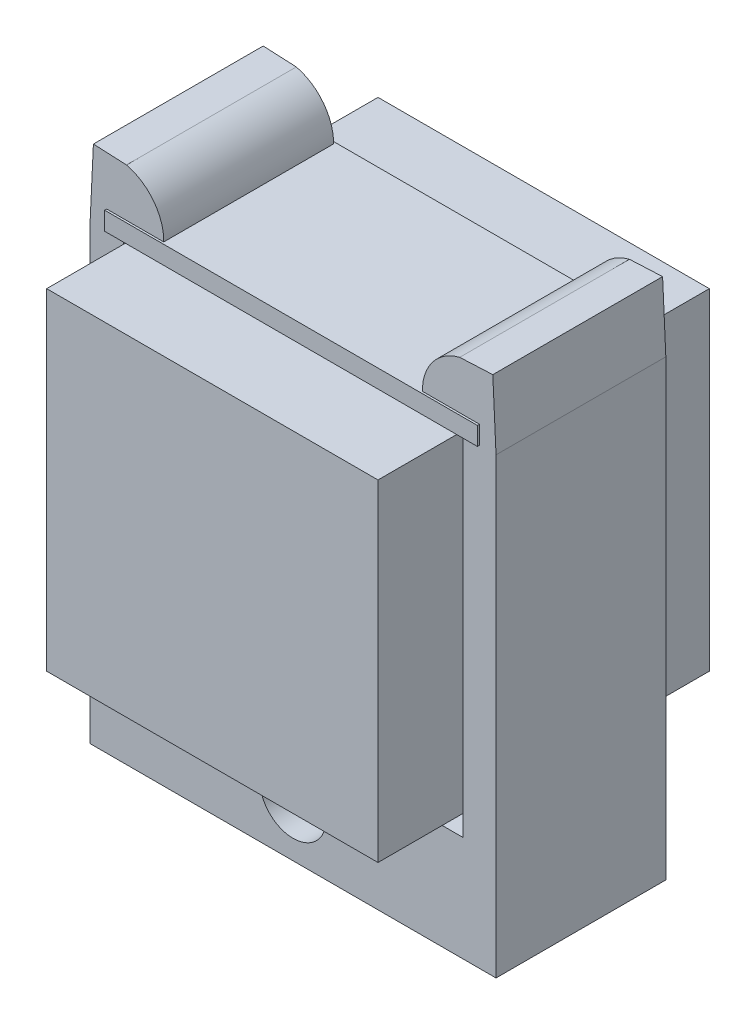
ISO-10303-21;
HEADER;
FILE_DESCRIPTION(('STEP AP214'),'2;1');
FILE_NAME('part.step','',(''),(''),'','','');
FILE_SCHEMA(('AUTOMOTIVE_DESIGN { 1 0 10303 214 1 1 1 1 }'));
ENDSEC;
DATA;
#1=APPLICATION_CONTEXT('core data for automotive mechanical design processes');
#2=APPLICATION_PROTOCOL_DEFINITION('international standard','automotive_design',2000,#1);
#3=PRODUCT_CONTEXT('',#1,'mechanical');
#4=PRODUCT('Part','Part','',(#3));
#5=PRODUCT_RELATED_PRODUCT_CATEGORY('part','',(#4));
#6=PRODUCT_DEFINITION_FORMATION('','',#4);
#7=PRODUCT_DEFINITION_CONTEXT('part definition',#1,'design');
#8=PRODUCT_DEFINITION('design','',#6,#7);
#9=PRODUCT_DEFINITION_SHAPE('','',#8);
#10=(LENGTH_UNIT() NAMED_UNIT(*) SI_UNIT(.MILLI.,.METRE.));
#11=(NAMED_UNIT(*) PLANE_ANGLE_UNIT() SI_UNIT($,.RADIAN.));
#12=(NAMED_UNIT(*) SI_UNIT($,.STERADIAN.) SOLID_ANGLE_UNIT());
#13=UNCERTAINTY_MEASURE_WITH_UNIT(LENGTH_MEASURE(1.E-05),#10,'distance_accuracy_value','');
#14=(GEOMETRIC_REPRESENTATION_CONTEXT(3) GLOBAL_UNCERTAINTY_ASSIGNED_CONTEXT((#13)) GLOBAL_UNIT_ASSIGNED_CONTEXT((#10,
#11,#12)) REPRESENTATION_CONTEXT('',''));
#15=CARTESIAN_POINT('',(0.,0.,0.));
#16=DIRECTION('',(0.,0.,1.));
#17=DIRECTION('',(1.,0.,0.));
#18=AXIS2_PLACEMENT_3D('',#15,#16,#17);
#19=CARTESIAN_POINT('',(-21.5280304458082,2.25144674939958,10.25));
#20=DIRECTION('',(0.,0.,-1.));
#21=DIRECTION('',(-1.,0.,0.));
#22=AXIS2_PLACEMENT_3D('',#19,#20,#21);
#23=CYLINDRICAL_SURFACE('',#22,5.92023811609857);
#24=CARTESIAN_POINT('',(-21.5280304458082,2.25144674939958,-10.25));
#25=DIRECTION('',(0.,0.,1.));
#26=DIRECTION('',(1.,0.,0.));
#27=AXIS2_PLACEMENT_3D('',#24,#25,#26);
#28=CIRCLE('',#27,5.92023811609857);
#29=CARTESIAN_POINT('',(-20.1144932238956,8.00045813167861,-10.25));
#30=VERTEX_POINT('',#29);
#31=CARTESIAN_POINT('',(-15.6144932238956,1.96984973883234,-10.25));
#32=VERTEX_POINT('',#31);
#33=EDGE_CURVE('E200',#30,#32,#28,.F.);
#34=ORIENTED_EDGE('',*,*,#33,.F.);
#35=DIRECTION('',(0.,0.,-1.));
#36=VECTOR('',#35,1.);
#37=CARTESIAN_POINT('',(-20.1144932238956,8.00045813167861,10.25));
#38=LINE('',#37,#36);
#39=CARTESIAN_POINT('',(-20.1144932238956,8.00045813167861,10.25));
#40=VERTEX_POINT('',#39);
#41=EDGE_CURVE('E12',#40,#30,#38,.T.);
#42=ORIENTED_EDGE('',*,*,#41,.F.);
#43=CARTESIAN_POINT('',(-21.5280304458082,2.25144674939958,10.25));
#44=DIRECTION('',(0.,0.,1.));
#45=DIRECTION('',(1.,0.,0.));
#46=AXIS2_PLACEMENT_3D('',#43,#44,#45);
#47=CIRCLE('',#46,5.92023811609857);
#48=CARTESIAN_POINT('',(-15.6144932238956,1.96984973883234,10.25));
#49=VERTEX_POINT('',#48);
#50=EDGE_CURVE('E243',#40,#49,#47,.F.);
#51=ORIENTED_EDGE('',*,*,#50,.T.);
#52=DIRECTION('',(0.,0.,-1.));
#53=VECTOR('',#52,1.);
#54=CARTESIAN_POINT('',(-15.6144932238956,1.96984973883234,10.25));
#55=LINE('',#54,#53);
#56=EDGE_CURVE('E71',#49,#32,#55,.T.);
#57=ORIENTED_EDGE('',*,*,#56,.T.);
#58=EDGE_LOOP('',(#34,#42,#51,#57));
#59=FACE_BOUND('',#58,.T.);
#60=ADVANCED_FACE('F55',(#59),#23,.T.);
#61=CARTESIAN_POINT('',(0.334604360953264,7.02669158001924,10.25));
#62=DIRECTION('',(0.0475651494154447,0.998868137724438,0.));
#63=DIRECTION('',(-0.998868137724438,0.0475651494154447,0.));
#64=AXIS2_PLACEMENT_3D('',#61,#62,#63);
#65=PLANE('',#64);
#66=DIRECTION('',(0.998868137724438,-0.0475651494154447,0.));
#67=VECTOR('',#66,1.);
#68=CARTESIAN_POINT('',(0.334604360953264,7.02669158001924,-10.25));
#69=LINE('',#68,#67);
#70=CARTESIAN_POINT('',(-24.1099657747934,8.19071872934039,-10.25));
#71=VERTEX_POINT('',#70);
#72=EDGE_CURVE('E202',#71,#30,#69,.T.);
#73=ORIENTED_EDGE('',*,*,#72,.F.);
#74=DIRECTION('',(0.,0.,-1.));
#75=VECTOR('',#74,1.);
#76=CARTESIAN_POINT('',(-24.1099657747934,8.19071872934039,10.25));
#77=LINE('',#76,#75);
#78=CARTESIAN_POINT('',(-24.1099657747934,8.19071872934039,10.25));
#79=VERTEX_POINT('',#78);
#80=EDGE_CURVE('E63',#79,#71,#77,.T.);
#81=ORIENTED_EDGE('',*,*,#80,.F.);
#82=DIRECTION('',(0.998868137724438,-0.0475651494154447,0.));
#83=VECTOR('',#82,1.);
#84=CARTESIAN_POINT('',(0.334604360953264,7.02669158001924,10.25));
#85=LINE('',#84,#83);
#86=EDGE_CURVE('E294',#79,#40,#85,.T.);
#87=ORIENTED_EDGE('',*,*,#86,.T.);
#88=ORIENTED_EDGE('',*,*,#41,.T.);
#89=EDGE_LOOP('',(#73,#81,#87,#88));
#90=FACE_BOUND('',#89,.T.);
#91=ADVANCED_FACE('F280',(#90),#65,.T.);
#92=CARTESIAN_POINT('',(-24.4445701357466,1.16402714932115,10.25));
#93=DIRECTION('',(-0.998868137724438,0.0475651494154446,0.));
#94=DIRECTION('',(-0.0475651494154446,-0.998868137724438,0.));
#95=AXIS2_PLACEMENT_3D('',#92,#93,#94);
#96=PLANE('',#95);
#97=DIRECTION('',(0.0475651494154446,0.998868137724438,0.));
#98=VECTOR('',#97,1.);
#99=CARTESIAN_POINT('',(-24.4445701357466,1.16402714932115,-10.25));
#100=LINE('',#99,#98);
#101=CARTESIAN_POINT('',(-24.5,0.,-10.25));
#102=VERTEX_POINT('',#101);
#103=EDGE_CURVE('E205',#102,#71,#100,.T.);
#104=ORIENTED_EDGE('',*,*,#103,.F.);
#105=DIRECTION('',(0.,0.,-1.));
#106=VECTOR('',#105,1.);
#107=CARTESIAN_POINT('',(-24.5,0.,10.25));
#108=LINE('',#107,#106);
#109=CARTESIAN_POINT('',(-24.5,0.,10.25));
#110=VERTEX_POINT('',#109);
#111=EDGE_CURVE('E269',#110,#102,#108,.T.);
#112=ORIENTED_EDGE('',*,*,#111,.F.);
#113=DIRECTION('',(0.0475651494154446,0.998868137724438,0.));
#114=VECTOR('',#113,1.);
#115=CARTESIAN_POINT('',(-24.4445701357466,1.16402714932115,10.25));
#116=LINE('',#115,#114);
#117=EDGE_CURVE('E276',#110,#79,#116,.T.);
#118=ORIENTED_EDGE('',*,*,#117,.T.);
#119=ORIENTED_EDGE('',*,*,#80,.T.);
#120=EDGE_LOOP('',(#104,#112,#118,#119));
#121=FACE_BOUND('',#120,.T.);
#122=ADVANCED_FACE('F274',(#121),#96,.T.);
#123=CARTESIAN_POINT('',(-24.5,0.,10.25));
#124=DIRECTION('',(-1.,0.,0.));
#125=DIRECTION('',(0.,0.,1.));
#126=AXIS2_PLACEMENT_3D('',#123,#124,#125);
#127=PLANE('',#126);
#128=DIRECTION('',(0.,1.,0.));
#129=VECTOR('',#128,1.);
#130=CARTESIAN_POINT('',(-24.5,0.,-10.25));
#131=LINE('',#130,#129);
#132=CARTESIAN_POINT('',(-24.5,-54.7,-10.25));
#133=VERTEX_POINT('',#132);
#134=EDGE_CURVE('E208',#133,#102,#131,.T.);
#135=ORIENTED_EDGE('',*,*,#134,.F.);
#136=DIRECTION('',(0.,0.,-1.));
#137=VECTOR('',#136,1.);
#138=CARTESIAN_POINT('',(-24.5,-54.7,10.25));
#139=LINE('',#138,#137);
#140=CARTESIAN_POINT('',(-24.5,-54.7,10.25));
#141=VERTEX_POINT('',#140);
#142=EDGE_CURVE('E267',#141,#133,#139,.T.);
#143=ORIENTED_EDGE('',*,*,#142,.F.);
#144=DIRECTION('',(0.,1.,0.));
#145=VECTOR('',#144,1.);
#146=CARTESIAN_POINT('',(-24.5,0.,10.25));
#147=LINE('',#146,#145);
#148=EDGE_CURVE('E291',#141,#110,#147,.T.);
#149=ORIENTED_EDGE('',*,*,#148,.T.);
#150=ORIENTED_EDGE('',*,*,#111,.T.);
#151=EDGE_LOOP('',(#135,#143,#149,#150));
#152=FACE_BOUND('',#151,.T.);
#153=ADVANCED_FACE('F288',(#152),#127,.T.);
#154=CARTESIAN_POINT('',(0.,-54.7,10.25));
#155=DIRECTION('',(0.,-1.,0.));
#156=DIRECTION('',(0.,0.,-1.));
#157=AXIS2_PLACEMENT_3D('',#154,#155,#156);
#158=PLANE('',#157);
#159=DIRECTION('',(-1.,0.,0.));
#160=VECTOR('',#159,1.);
#161=CARTESIAN_POINT('',(0.,-54.7,-10.25));
#162=LINE('',#161,#160);
#163=CARTESIAN_POINT('',(24.5,-54.7,-10.25));
#164=VERTEX_POINT('',#163);
#165=EDGE_CURVE('E211',#164,#133,#162,.T.);
#166=ORIENTED_EDGE('',*,*,#165,.F.);
#167=DIRECTION('',(0.,0.,-1.));
#168=VECTOR('',#167,1.);
#169=CARTESIAN_POINT('',(24.5,-54.7,10.25));
#170=LINE('',#169,#168);
#171=CARTESIAN_POINT('',(24.5,-54.7,10.25));
#172=VERTEX_POINT('',#171);
#173=EDGE_CURVE('E265',#172,#164,#170,.T.);
#174=ORIENTED_EDGE('',*,*,#173,.F.);
#175=DIRECTION('',(-1.,0.,0.));
#176=VECTOR('',#175,1.);
#177=CARTESIAN_POINT('',(0.,-54.7,10.25));
#178=LINE('',#177,#176);
#179=EDGE_CURVE('E296',#172,#141,#178,.T.);
#180=ORIENTED_EDGE('',*,*,#179,.T.);
#181=ORIENTED_EDGE('',*,*,#142,.T.);
#182=EDGE_LOOP('',(#166,#174,#180,#181));
#183=FACE_BOUND('',#182,.T.);
#184=ADVANCED_FACE('F343',(#183),#158,.T.);
#185=CARTESIAN_POINT('',(24.5,0.,10.25));
#186=DIRECTION('',(-1.,0.,0.));
#187=DIRECTION('',(0.,0.,1.));
#188=AXIS2_PLACEMENT_3D('',#185,#186,#187);
#189=PLANE('',#188);
#190=DIRECTION('',(0.,1.,0.));
#191=VECTOR('',#190,1.);
#192=CARTESIAN_POINT('',(24.5,0.,-10.25));
#193=LINE('',#192,#191);
#194=CARTESIAN_POINT('',(24.5,0.,-10.25));
#195=VERTEX_POINT('',#194);
#196=EDGE_CURVE('E214',#164,#195,#193,.T.);
#197=ORIENTED_EDGE('',*,*,#196,.T.);
#198=DIRECTION('',(0.,0.,-1.));
#199=VECTOR('',#198,1.);
#200=CARTESIAN_POINT('',(24.5,0.,10.25));
#201=LINE('',#200,#199);
#202=CARTESIAN_POINT('',(24.5,0.,10.25));
#203=VERTEX_POINT('',#202);
#204=EDGE_CURVE('E262',#203,#195,#201,.T.);
#205=ORIENTED_EDGE('',*,*,#204,.F.);
#206=DIRECTION('',(0.,1.,0.));
#207=VECTOR('',#206,1.);
#208=CARTESIAN_POINT('',(24.5,0.,10.25));
#209=LINE('',#208,#207);
#210=EDGE_CURVE('E302',#172,#203,#209,.T.);
#211=ORIENTED_EDGE('',*,*,#210,.F.);
#212=ORIENTED_EDGE('',*,*,#173,.T.);
#213=EDGE_LOOP('',(#197,#205,#211,#212));
#214=FACE_BOUND('',#213,.T.);
#215=ADVANCED_FACE('F346',(#214),#189,.F.);
#216=CARTESIAN_POINT('',(24.4445701357466,1.16402714932115,10.25));
#217=DIRECTION('',(-0.998868137724438,-0.0475651494154446,0.));
#218=DIRECTION('',(0.0475651494154446,-0.998868137724438,0.));
#219=AXIS2_PLACEMENT_3D('',#216,#217,#218);
#220=PLANE('',#219);
#221=DIRECTION('',(-0.0475651494154446,0.998868137724438,0.));
#222=VECTOR('',#221,1.);
#223=CARTESIAN_POINT('',(24.4445701357466,1.16402714932115,-10.25));
#224=LINE('',#223,#222);
#225=CARTESIAN_POINT('',(24.1099657747934,8.19071872934039,-10.25));
#226=VERTEX_POINT('',#225);
#227=EDGE_CURVE('E216',#195,#226,#224,.T.);
#228=ORIENTED_EDGE('',*,*,#227,.T.);
#229=DIRECTION('',(0.,0.,-1.));
#230=VECTOR('',#229,1.);
#231=CARTESIAN_POINT('',(24.1099657747934,8.19071872934039,10.25));
#232=LINE('',#231,#230);
#233=CARTESIAN_POINT('',(24.1099657747934,8.19071872934039,10.25));
#234=VERTEX_POINT('',#233);
#235=EDGE_CURVE('E259',#234,#226,#232,.T.);
#236=ORIENTED_EDGE('',*,*,#235,.F.);
#237=DIRECTION('',(-0.0475651494154446,0.998868137724438,0.));
#238=VECTOR('',#237,1.);
#239=CARTESIAN_POINT('',(24.4445701357466,1.16402714932115,10.25));
#240=LINE('',#239,#238);
#241=EDGE_CURVE('E304',#203,#234,#240,.T.);
#242=ORIENTED_EDGE('',*,*,#241,.F.);
#243=ORIENTED_EDGE('',*,*,#204,.T.);
#244=EDGE_LOOP('',(#228,#236,#242,#243));
#245=FACE_BOUND('',#244,.T.);
#246=ADVANCED_FACE('F350',(#245),#220,.F.);
#247=CARTESIAN_POINT('',(-0.334604360953264,7.02669158001924,10.25));
#248=DIRECTION('',(0.0475651494154447,-0.998868137724438,0.));
#249=DIRECTION('',(0.998868137724438,0.0475651494154447,0.));
#250=AXIS2_PLACEMENT_3D('',#247,#248,#249);
#251=PLANE('',#250);
#252=DIRECTION('',(-0.998868137724438,-0.0475651494154447,0.));
#253=VECTOR('',#252,1.);
#254=CARTESIAN_POINT('',(-0.334604360953264,7.02669158001924,-10.25));
#255=LINE('',#254,#253);
#256=CARTESIAN_POINT('',(20.1144932238956,8.00045813167861,-10.25));
#257=VERTEX_POINT('',#256);
#258=EDGE_CURVE('E218',#226,#257,#255,.T.);
#259=ORIENTED_EDGE('',*,*,#258,.T.);
#260=DIRECTION('',(0.,0.,-1.));
#261=VECTOR('',#260,1.);
#262=CARTESIAN_POINT('',(20.1144932238956,8.00045813167861,10.25));
#263=LINE('',#262,#261);
#264=CARTESIAN_POINT('',(20.1144932238956,8.00045813167861,10.25));
#265=VERTEX_POINT('',#264);
#266=EDGE_CURVE('E256',#265,#257,#263,.T.);
#267=ORIENTED_EDGE('',*,*,#266,.F.);
#268=DIRECTION('',(-0.998868137724438,-0.0475651494154447,0.));
#269=VECTOR('',#268,1.);
#270=CARTESIAN_POINT('',(-0.334604360953264,7.02669158001924,10.25));
#271=LINE('',#270,#269);
#272=EDGE_CURVE('E306',#234,#265,#271,.T.);
#273=ORIENTED_EDGE('',*,*,#272,.F.);
#274=ORIENTED_EDGE('',*,*,#235,.T.);
#275=EDGE_LOOP('',(#259,#267,#273,#274));
#276=FACE_BOUND('',#275,.T.);
#277=ADVANCED_FACE('F354',(#276),#251,.F.);
#278=CARTESIAN_POINT('',(21.5280304458082,2.25144674939958,10.25));
#279=DIRECTION('',(0.,0.,-1.));
#280=DIRECTION('',(-1.,0.,0.));
#281=AXIS2_PLACEMENT_3D('',#278,#279,#280);
#282=CYLINDRICAL_SURFACE('',#281,5.92023811609857);
#283=CARTESIAN_POINT('',(21.5280304458082,2.25144674939958,-10.25));
#284=DIRECTION('',(0.,0.,1.));
#285=DIRECTION('',(1.,0.,0.));
#286=AXIS2_PLACEMENT_3D('',#283,#284,#285);
#287=CIRCLE('',#286,5.92023811609857);
#288=CARTESIAN_POINT('',(15.6144932238956,1.96984973883234,-10.25));
#289=VERTEX_POINT('',#288);
#290=EDGE_CURVE('E220',#257,#289,#287,.T.);
#291=ORIENTED_EDGE('',*,*,#290,.T.);
#292=DIRECTION('',(0.,0.,-1.));
#293=VECTOR('',#292,1.);
#294=CARTESIAN_POINT('',(15.6144932238956,1.96984973883234,10.25));
#295=LINE('',#294,#293);
#296=CARTESIAN_POINT('',(15.6144932238956,1.96984973883234,10.25));
#297=VERTEX_POINT('',#296);
#298=EDGE_CURVE('E253',#297,#289,#295,.T.);
#299=ORIENTED_EDGE('',*,*,#298,.F.);
#300=CARTESIAN_POINT('',(21.5280304458082,2.25144674939958,10.25));
#301=DIRECTION('',(0.,0.,1.));
#302=DIRECTION('',(1.,0.,0.));
#303=AXIS2_PLACEMENT_3D('',#300,#301,#302);
#304=CIRCLE('',#303,5.92023811609857);
#305=EDGE_CURVE('E308',#265,#297,#304,.T.);
#306=ORIENTED_EDGE('',*,*,#305,.F.);
#307=ORIENTED_EDGE('',*,*,#266,.T.);
#308=EDGE_LOOP('',(#291,#299,#306,#307));
#309=FACE_BOUND('',#308,.T.);
#310=ADVANCED_FACE('F358',(#309),#282,.T.);
#311=CARTESIAN_POINT('',(-0.05826323821625,1.22352800254137,10.25));
#312=DIRECTION('',(-0.0475651494154449,0.998868137724438,0.));
#313=DIRECTION('',(-0.998868137724438,-0.0475651494154449,0.));
#314=AXIS2_PLACEMENT_3D('',#311,#312,#313);
#315=PLANE('',#314);
#316=DIRECTION('',(0.998868137724438,0.0475651494154449,0.));
#317=VECTOR('',#316,1.);
#318=CARTESIAN_POINT('',(-0.05826323821625,1.22352800254137,-10.25));
#319=LINE('',#318,#317);
#320=CARTESIAN_POINT('',(20.395356671286,2.19750990299376,-10.25));
#321=VERTEX_POINT('',#320);
#322=EDGE_CURVE('E222',#289,#321,#319,.T.);
#323=ORIENTED_EDGE('',*,*,#322,.T.);
#324=DIRECTION('',(0.,0.,-1.));
#325=VECTOR('',#324,1.);
#326=CARTESIAN_POINT('',(20.395356671286,2.19750990299376,10.25));
#327=LINE('',#326,#325);
#328=CARTESIAN_POINT('',(20.395356671286,2.19750990299376,10.25));
#329=VERTEX_POINT('',#328);
#330=EDGE_CURVE('E251',#329,#321,#327,.T.);
#331=ORIENTED_EDGE('',*,*,#330,.F.);
#332=DIRECTION('',(0.998868137724438,0.0475651494154449,0.));
#333=VECTOR('',#332,1.);
#334=CARTESIAN_POINT('',(-0.05826323821625,1.22352800254137,10.25));
#335=LINE('',#334,#333);
#336=EDGE_CURVE('E310',#297,#329,#335,.T.);
#337=ORIENTED_EDGE('',*,*,#336,.F.);
#338=ORIENTED_EDGE('',*,*,#298,.T.);
#339=EDGE_LOOP('',(#323,#331,#337,#338));
#340=FACE_BOUND('',#339,.T.);
#341=ADVANCED_FACE('F362',(#340),#315,.F.);
#342=CARTESIAN_POINT('',(20.4536199095023,0.973981900452354,10.25));
#343=DIRECTION('',(-0.998868137724438,-0.0475651494154428,0.));
#344=DIRECTION('',(0.0475651494154428,-0.998868137724438,0.));
#345=AXIS2_PLACEMENT_3D('',#342,#343,#344);
#346=PLANE('',#345);
#347=DIRECTION('',(-0.0475651494154428,0.998868137724438,0.));
#348=VECTOR('',#347,1.);
#349=CARTESIAN_POINT('',(20.4536199095023,0.973981900452354,-10.25));
#350=LINE('',#349,#348);
#351=CARTESIAN_POINT('',(20.5,0.,-10.25));
#352=VERTEX_POINT('',#351);
#353=EDGE_CURVE('E225',#352,#321,#350,.T.);
#354=ORIENTED_EDGE('',*,*,#353,.F.);
#355=DIRECTION('',(0.,0.,-1.));
#356=VECTOR('',#355,1.);
#357=CARTESIAN_POINT('',(20.5,0.,10.25));
#358=LINE('',#357,#356);
#359=CARTESIAN_POINT('',(20.5,0.,10.25));
#360=VERTEX_POINT('',#359);
#361=EDGE_CURVE('E249',#360,#352,#358,.T.);
#362=ORIENTED_EDGE('',*,*,#361,.F.);
#363=DIRECTION('',(-0.0475651494154428,0.998868137724438,0.));
#364=VECTOR('',#363,1.);
#365=CARTESIAN_POINT('',(20.4536199095023,0.973981900452354,10.25));
#366=LINE('',#365,#364);
#367=EDGE_CURVE('E312',#360,#329,#366,.T.);
#368=ORIENTED_EDGE('',*,*,#367,.T.);
#369=ORIENTED_EDGE('',*,*,#330,.T.);
#370=EDGE_LOOP('',(#354,#362,#368,#369));
#371=FACE_BOUND('',#370,.T.);
#372=ADVANCED_FACE('F366',(#371),#346,.T.);
#373=CARTESIAN_POINT('',(20.5,0.,10.25));
#374=DIRECTION('',(-1.,0.,0.));
#375=DIRECTION('',(0.,0.,1.));
#376=AXIS2_PLACEMENT_3D('',#373,#374,#375);
#377=PLANE('',#376);
#378=DIRECTION('',(0.,1.,0.));
#379=VECTOR('',#378,1.);
#380=CARTESIAN_POINT('',(20.5,0.,-10.25));
#381=LINE('',#380,#379);
#382=CARTESIAN_POINT('',(20.5,-42.,-10.25));
#383=VERTEX_POINT('',#382);
#384=EDGE_CURVE('E228',#383,#352,#381,.T.);
#385=ORIENTED_EDGE('',*,*,#384,.F.);
#386=DIRECTION('',(0.,0.,-1.));
#387=VECTOR('',#386,1.);
#388=CARTESIAN_POINT('',(20.5,-42.,10.25));
#389=LINE('',#388,#387);
#390=CARTESIAN_POINT('',(20.5,-42.,10.25));
#391=VERTEX_POINT('',#390);
#392=EDGE_CURVE('E247',#391,#383,#389,.T.);
#393=ORIENTED_EDGE('',*,*,#392,.F.);
#394=DIRECTION('',(0.,1.,0.));
#395=VECTOR('',#394,1.);
#396=CARTESIAN_POINT('',(20.5,0.,10.25));
#397=LINE('',#396,#395);
#398=EDGE_CURVE('E315',#391,#360,#397,.T.);
#399=ORIENTED_EDGE('',*,*,#398,.T.);
#400=ORIENTED_EDGE('',*,*,#361,.T.);
#401=EDGE_LOOP('',(#385,#393,#399,#400));
#402=FACE_BOUND('',#401,.T.);
#403=ADVANCED_FACE('F370',(#402),#377,.T.);
#404=CARTESIAN_POINT('',(0.,-42.,10.25));
#405=DIRECTION('',(0.,1.,0.));
#406=DIRECTION('',(0.,0.,1.));
#407=AXIS2_PLACEMENT_3D('',#404,#405,#406);
#408=PLANE('',#407);
#409=DIRECTION('',(1.,0.,0.));
#410=VECTOR('',#409,1.);
#411=CARTESIAN_POINT('',(0.,-42.,-10.25));
#412=LINE('',#411,#410);
#413=CARTESIAN_POINT('',(-20.5,-42.,-10.25));
#414=VERTEX_POINT('',#413);
#415=EDGE_CURVE('E231',#414,#383,#412,.T.);
#416=ORIENTED_EDGE('',*,*,#415,.F.);
#417=DIRECTION('',(0.,0.,-1.));
#418=VECTOR('',#417,1.);
#419=CARTESIAN_POINT('',(-20.5,-42.,10.25));
#420=LINE('',#419,#418);
#421=CARTESIAN_POINT('',(-20.5,-42.,10.25));
#422=VERTEX_POINT('',#421);
#423=EDGE_CURVE('E189',#422,#414,#420,.T.);
#424=ORIENTED_EDGE('',*,*,#423,.F.);
#425=DIRECTION('',(1.,0.,0.));
#426=VECTOR('',#425,1.);
#427=CARTESIAN_POINT('',(0.,-42.,10.25));
#428=LINE('',#427,#426);
#429=EDGE_CURVE('E179',#422,#391,#428,.T.);
#430=ORIENTED_EDGE('',*,*,#429,.T.);
#431=ORIENTED_EDGE('',*,*,#392,.T.);
#432=EDGE_LOOP('',(#416,#424,#430,#431));
#433=FACE_BOUND('',#432,.T.);
#434=ADVANCED_FACE('F319',(#433),#408,.T.);
#435=CARTESIAN_POINT('',(-20.5,0.,10.25));
#436=DIRECTION('',(-1.,0.,0.));
#437=DIRECTION('',(0.,0.,1.));
#438=AXIS2_PLACEMENT_3D('',#435,#436,#437);
#439=PLANE('',#438);
#440=DIRECTION('',(0.,1.,0.));
#441=VECTOR('',#440,1.);
#442=CARTESIAN_POINT('',(-20.5,0.,-10.25));
#443=LINE('',#442,#441);
#444=CARTESIAN_POINT('',(-20.5,0.,-10.25));
#445=VERTEX_POINT('',#444);
#446=EDGE_CURVE('E186',#414,#445,#443,.T.);
#447=ORIENTED_EDGE('',*,*,#446,.T.);
#448=DIRECTION('',(0.,0.,-1.));
#449=VECTOR('',#448,1.);
#450=CARTESIAN_POINT('',(-20.5,0.,10.25));
#451=LINE('',#450,#449);
#452=CARTESIAN_POINT('',(-20.5,0.,10.25));
#453=VERTEX_POINT('',#452);
#454=EDGE_CURVE('E183',#453,#445,#451,.T.);
#455=ORIENTED_EDGE('',*,*,#454,.F.);
#456=DIRECTION('',(0.,1.,0.));
#457=VECTOR('',#456,1.);
#458=CARTESIAN_POINT('',(-20.5,0.,10.25));
#459=LINE('',#458,#457);
#460=EDGE_CURVE('E170',#422,#453,#459,.T.);
#461=ORIENTED_EDGE('',*,*,#460,.F.);
#462=ORIENTED_EDGE('',*,*,#423,.T.);
#463=EDGE_LOOP('',(#447,#455,#461,#462));
#464=FACE_BOUND('',#463,.T.);
#465=ADVANCED_FACE('F184',(#464),#439,.F.);
#466=CARTESIAN_POINT('',(-20.4536199095023,0.973981900452354,10.25));
#467=DIRECTION('',(-0.998868137724438,0.0475651494154428,0.));
#468=DIRECTION('',(-0.0475651494154428,-0.998868137724438,0.));
#469=AXIS2_PLACEMENT_3D('',#466,#467,#468);
#470=PLANE('',#469);
#471=DIRECTION('',(0.0475651494154428,0.998868137724438,0.));
#472=VECTOR('',#471,1.);
#473=CARTESIAN_POINT('',(-20.4536199095023,0.973981900452354,-10.25));
#474=LINE('',#473,#472);
#475=CARTESIAN_POINT('',(-20.395356671286,2.19750990299376,-10.25));
#476=VERTEX_POINT('',#475);
#477=EDGE_CURVE('E235',#445,#476,#474,.T.);
#478=ORIENTED_EDGE('',*,*,#477,.T.);
#479=DIRECTION('',(0.,0.,-1.));
#480=VECTOR('',#479,1.);
#481=CARTESIAN_POINT('',(-20.395356671286,2.19750990299376,10.25));
#482=LINE('',#481,#480);
#483=CARTESIAN_POINT('',(-20.395356671286,2.19750990299376,10.25));
#484=VERTEX_POINT('',#483);
#485=EDGE_CURVE('E121',#484,#476,#482,.T.);
#486=ORIENTED_EDGE('',*,*,#485,.F.);
#487=DIRECTION('',(0.0475651494154428,0.998868137724438,0.));
#488=VECTOR('',#487,1.);
#489=CARTESIAN_POINT('',(-20.4536199095023,0.973981900452354,10.25));
#490=LINE('',#489,#488);
#491=EDGE_CURVE('E176',#453,#484,#490,.T.);
#492=ORIENTED_EDGE('',*,*,#491,.F.);
#493=ORIENTED_EDGE('',*,*,#454,.T.);
#494=EDGE_LOOP('',(#478,#486,#492,#493));
#495=FACE_BOUND('',#494,.T.);
#496=ADVANCED_FACE('F191',(#495),#470,.F.);
#497=CARTESIAN_POINT('',(0.05826323821625,1.22352800254137,10.25));
#498=DIRECTION('',(-0.0475651494154449,-0.998868137724438,0.));
#499=DIRECTION('',(0.998868137724438,-0.0475651494154449,0.));
#500=AXIS2_PLACEMENT_3D('',#497,#498,#499);
#501=PLANE('',#500);
#502=DIRECTION('',(-0.998868137724438,0.0475651494154449,0.));
#503=VECTOR('',#502,1.);
#504=CARTESIAN_POINT('',(0.05826323821625,1.22352800254137,-10.25));
#505=LINE('',#504,#503);
#506=EDGE_CURVE('E237',#32,#476,#505,.T.);
#507=ORIENTED_EDGE('',*,*,#506,.F.);
#508=ORIENTED_EDGE('',*,*,#56,.F.);
#509=DIRECTION('',(-0.998868137724438,0.0475651494154449,0.));
#510=VECTOR('',#509,1.);
#511=CARTESIAN_POINT('',(0.05826323821625,1.22352800254137,10.25));
#512=LINE('',#511,#510);
#513=EDGE_CURVE('E192',#49,#484,#512,.T.);
#514=ORIENTED_EDGE('',*,*,#513,.T.);
#515=ORIENTED_EDGE('',*,*,#485,.T.);
#516=EDGE_LOOP('',(#507,#508,#514,#515));
#517=FACE_BOUND('',#516,.T.);
#518=ADVANCED_FACE('F321',(#517),#501,.T.);
#519=CARTESIAN_POINT('',(0.,-48.35,10.25));
#520=DIRECTION('',(0.,0.,-1.));
#521=DIRECTION('',(-1.,0.,0.));
#522=AXIS2_PLACEMENT_3D('',#519,#520,#521);
#523=CYLINDRICAL_SURFACE('',#522,4.);
#524=CARTESIAN_POINT('',(0.,-48.35,10.25));
#525=DIRECTION('',(0.,0.,1.));
#526=DIRECTION('',(1.,0.,0.));
#527=AXIS2_PLACEMENT_3D('',#524,#525,#526);
#528=CIRCLE('',#527,4.);
#529=CARTESIAN_POINT('',(4.,-48.35,10.25));
#530=VERTEX_POINT('',#529);
#531=EDGE_CURVE('E194',#530,#530,#528,.T.);
#532=ORIENTED_EDGE('',*,*,#531,.T.);
#533=EDGE_LOOP('',(#532));
#534=FACE_BOUND('',#533,.T.);
#535=CARTESIAN_POINT('',(0.,-48.35,-10.25));
#536=DIRECTION('',(0.,0.,1.));
#537=DIRECTION('',(1.,0.,0.));
#538=AXIS2_PLACEMENT_3D('',#535,#536,#537);
#539=CIRCLE('',#538,4.);
#540=CARTESIAN_POINT('',(4.,-48.35,-10.25));
#541=VERTEX_POINT('',#540);
#542=EDGE_CURVE('E240',#541,#541,#539,.T.);
#543=ORIENTED_EDGE('',*,*,#542,.F.);
#544=EDGE_LOOP('',(#543));
#545=FACE_BOUND('',#544,.T.);
#546=ADVANCED_FACE('F323',(#534,#545),#523,.F.);
#547=CARTESIAN_POINT('',(0.,0.,10.25));
#548=DIRECTION('',(0.,0.,1.));
#549=DIRECTION('',(1.,0.,0.));
#550=AXIS2_PLACEMENT_3D('',#547,#548,#549);
#551=PLANE('',#550);
#552=ORIENTED_EDGE('',*,*,#50,.F.);
#553=ORIENTED_EDGE('',*,*,#86,.F.);
#554=ORIENTED_EDGE('',*,*,#117,.F.);
#555=ORIENTED_EDGE('',*,*,#148,.F.);
#556=ORIENTED_EDGE('',*,*,#179,.F.);
#557=ORIENTED_EDGE('',*,*,#210,.T.);
#558=ORIENTED_EDGE('',*,*,#241,.T.);
#559=ORIENTED_EDGE('',*,*,#272,.T.);
#560=ORIENTED_EDGE('',*,*,#305,.T.);
#561=ORIENTED_EDGE('',*,*,#336,.T.);
#562=ORIENTED_EDGE('',*,*,#367,.F.);
#563=ORIENTED_EDGE('',*,*,#398,.F.);
#564=ORIENTED_EDGE('',*,*,#429,.F.);
#565=ORIENTED_EDGE('',*,*,#460,.T.);
#566=ORIENTED_EDGE('',*,*,#491,.T.);
#567=ORIENTED_EDGE('',*,*,#513,.F.);
#568=EDGE_LOOP('',(#552,#553,#554,#555,#556,#557,#558,#559,#560,#561,#562,#563,#564,#565,#566,#567));
#569=FACE_BOUND('',#568,.T.);
#570=ORIENTED_EDGE('',*,*,#531,.F.);
#571=EDGE_LOOP('',(#570));
#572=FACE_BOUND('',#571,.T.);
#573=ADVANCED_FACE('F172',(#569,#572),#551,.T.);
#574=CARTESIAN_POINT('',(0.,0.,-10.25));
#575=DIRECTION('',(0.,0.,1.));
#576=DIRECTION('',(1.,0.,0.));
#577=AXIS2_PLACEMENT_3D('',#574,#575,#576);
#578=PLANE('',#577);
#579=ORIENTED_EDGE('',*,*,#33,.T.);
#580=ORIENTED_EDGE('',*,*,#506,.T.);
#581=ORIENTED_EDGE('',*,*,#477,.F.);
#582=ORIENTED_EDGE('',*,*,#446,.F.);
#583=ORIENTED_EDGE('',*,*,#415,.T.);
#584=ORIENTED_EDGE('',*,*,#384,.T.);
#585=ORIENTED_EDGE('',*,*,#353,.T.);
#586=ORIENTED_EDGE('',*,*,#322,.F.);
#587=ORIENTED_EDGE('',*,*,#290,.F.);
#588=ORIENTED_EDGE('',*,*,#258,.F.);
#589=ORIENTED_EDGE('',*,*,#227,.F.);
#590=ORIENTED_EDGE('',*,*,#196,.F.);
#591=ORIENTED_EDGE('',*,*,#165,.T.);
#592=ORIENTED_EDGE('',*,*,#134,.T.);
#593=ORIENTED_EDGE('',*,*,#103,.T.);
#594=ORIENTED_EDGE('',*,*,#72,.T.);
#595=EDGE_LOOP('',(#579,#580,#581,#582,#583,#584,#585,#586,#587,#588,#589,#590,#591,#592,#593,#594));
#596=FACE_BOUND('',#595,.T.);
#597=ORIENTED_EDGE('',*,*,#542,.T.);
#598=EDGE_LOOP('',(#597));
#599=FACE_BOUND('',#598,.T.);
#600=ADVANCED_FACE('F282',(#596,#599),#578,.F.);
#601=CLOSED_SHELL('',(#60,#91,#122,#153,#184,#215,#246,#277,#310,#341,#372,#403,#434,#465,#496,
#518,#546,#573,#600));
#602=MANIFOLD_SOLID_BREP('B2',#601);
#603=CARTESIAN_POINT('',(20.,-40.,20.));
#604=DIRECTION('',(1.,0.,0.));
#605=DIRECTION('',(0.,0.,-1.));
#606=AXIS2_PLACEMENT_3D('',#603,#604,#605);
#607=PLANE('',#606);
#608=DIRECTION('',(0.,0.,-1.));
#609=VECTOR('',#608,1.);
#610=CARTESIAN_POINT('',(20.,0.,20.));
#611=LINE('',#610,#609);
#612=CARTESIAN_POINT('',(20.,0.,20.));
#613=VERTEX_POINT('',#612);
#614=CARTESIAN_POINT('',(20.,0.,-20.));
#615=VERTEX_POINT('',#614);
#616=EDGE_CURVE('E653',#613,#615,#611,.T.);
#617=ORIENTED_EDGE('',*,*,#616,.F.);
#618=DIRECTION('',(0.,1.,0.));
#619=VECTOR('',#618,1.);
#620=CARTESIAN_POINT('',(20.,-40.,20.));
#621=LINE('',#620,#619);
#622=CARTESIAN_POINT('',(20.,-40.,20.));
#623=VERTEX_POINT('',#622);
#624=EDGE_CURVE('E53',#623,#613,#621,.T.);
#625=ORIENTED_EDGE('',*,*,#624,.F.);
#626=DIRECTION('',(0.,0.,-1.));
#627=VECTOR('',#626,1.);
#628=CARTESIAN_POINT('',(20.,-40.,20.));
#629=LINE('',#628,#627);
#630=CARTESIAN_POINT('',(20.,-40.,-20.));
#631=VERTEX_POINT('',#630);
#632=EDGE_CURVE('E645',#623,#631,#629,.T.);
#633=ORIENTED_EDGE('',*,*,#632,.T.);
#634=DIRECTION('',(0.,1.,0.));
#635=VECTOR('',#634,1.);
#636=CARTESIAN_POINT('',(20.,-40.,-20.));
#637=LINE('',#636,#635);
#638=EDGE_CURVE('E586',#631,#615,#637,.T.);
#639=ORIENTED_EDGE('',*,*,#638,.T.);
#640=EDGE_LOOP('',(#617,#625,#633,#639));
#641=FACE_BOUND('',#640,.T.);
#642=ADVANCED_FACE('F583',(#641),#607,.T.);
#643=CARTESIAN_POINT('',(-20.,-40.,20.));
#644=DIRECTION('',(0.,0.,1.));
#645=DIRECTION('',(1.,0.,0.));
#646=AXIS2_PLACEMENT_3D('',#643,#644,#645);
#647=PLANE('',#646);
#648=DIRECTION('',(1.,0.,0.));
#649=VECTOR('',#648,1.);
#650=CARTESIAN_POINT('',(-20.,0.,20.));
#651=LINE('',#650,#649);
#652=CARTESIAN_POINT('',(-20.,0.,20.));
#653=VERTEX_POINT('',#652);
#654=EDGE_CURVE('E648',#653,#613,#651,.T.);
#655=ORIENTED_EDGE('',*,*,#654,.F.);
#656=DIRECTION('',(0.,1.,0.));
#657=VECTOR('',#656,1.);
#658=CARTESIAN_POINT('',(-20.,-40.,20.));
#659=LINE('',#658,#657);
#660=CARTESIAN_POINT('',(-20.,-40.,20.));
#661=VERTEX_POINT('',#660);
#662=EDGE_CURVE('E593',#661,#653,#659,.T.);
#663=ORIENTED_EDGE('',*,*,#662,.F.);
#664=DIRECTION('',(1.,0.,0.));
#665=VECTOR('',#664,1.);
#666=CARTESIAN_POINT('',(-20.,-40.,20.));
#667=LINE('',#666,#665);
#668=EDGE_CURVE('E640',#661,#623,#667,.T.);
#669=ORIENTED_EDGE('',*,*,#668,.T.);
#670=ORIENTED_EDGE('',*,*,#624,.T.);
#671=EDGE_LOOP('',(#655,#663,#669,#670));
#672=FACE_BOUND('',#671,.T.);
#673=ADVANCED_FACE('F669',(#672),#647,.T.);
#674=CARTESIAN_POINT('',(-20.,-40.,20.));
#675=DIRECTION('',(-1.,0.,0.));
#676=DIRECTION('',(0.,0.,1.));
#677=AXIS2_PLACEMENT_3D('',#674,#675,#676);
#678=PLANE('',#677);
#679=DIRECTION('',(0.,0.,1.));
#680=VECTOR('',#679,1.);
#681=CARTESIAN_POINT('',(-20.,0.,20.));
#682=LINE('',#681,#680);
#683=CARTESIAN_POINT('',(-20.,0.,-20.));
#684=VERTEX_POINT('',#683);
#685=EDGE_CURVE('E634',#684,#653,#682,.T.);
#686=ORIENTED_EDGE('',*,*,#685,.F.);
#687=DIRECTION('',(0.,1.,0.));
#688=VECTOR('',#687,1.);
#689=CARTESIAN_POINT('',(-20.,-40.,-20.));
#690=LINE('',#689,#688);
#691=CARTESIAN_POINT('',(-20.,-40.,-20.));
#692=VERTEX_POINT('',#691);
#693=EDGE_CURVE('E629',#692,#684,#690,.T.);
#694=ORIENTED_EDGE('',*,*,#693,.F.);
#695=DIRECTION('',(0.,0.,1.));
#696=VECTOR('',#695,1.);
#697=CARTESIAN_POINT('',(-20.,-40.,20.));
#698=LINE('',#697,#696);
#699=EDGE_CURVE('E632',#692,#661,#698,.T.);
#700=ORIENTED_EDGE('',*,*,#699,.T.);
#701=ORIENTED_EDGE('',*,*,#662,.T.);
#702=EDGE_LOOP('',(#686,#694,#700,#701));
#703=FACE_BOUND('',#702,.T.);
#704=ADVANCED_FACE('F631',(#703),#678,.T.);
#705=CARTESIAN_POINT('',(-20.,-40.,-20.));
#706=DIRECTION('',(0.,0.,-1.));
#707=DIRECTION('',(-1.,0.,0.));
#708=AXIS2_PLACEMENT_3D('',#705,#706,#707);
#709=PLANE('',#708);
#710=DIRECTION('',(-1.,0.,0.));
#711=VECTOR('',#710,1.);
#712=CARTESIAN_POINT('',(-20.,0.,-20.));
#713=LINE('',#712,#711);
#714=EDGE_CURVE('E657',#615,#684,#713,.T.);
#715=ORIENTED_EDGE('',*,*,#714,.F.);
#716=ORIENTED_EDGE('',*,*,#638,.F.);
#717=DIRECTION('',(-1.,0.,0.));
#718=VECTOR('',#717,1.);
#719=CARTESIAN_POINT('',(-20.,-40.,-20.));
#720=LINE('',#719,#718);
#721=EDGE_CURVE('E639',#631,#692,#720,.T.);
#722=ORIENTED_EDGE('',*,*,#721,.T.);
#723=ORIENTED_EDGE('',*,*,#693,.T.);
#724=EDGE_LOOP('',(#715,#716,#722,#723));
#725=FACE_BOUND('',#724,.T.);
#726=ADVANCED_FACE('F643',(#725),#709,.T.);
#727=CARTESIAN_POINT('',(0.,-40.,0.));
#728=DIRECTION('',(0.,-1.,0.));
#729=DIRECTION('',(0.,0.,-1.));
#730=AXIS2_PLACEMENT_3D('',#727,#728,#729);
#731=PLANE('',#730);
#732=ORIENTED_EDGE('',*,*,#632,.F.);
#733=ORIENTED_EDGE('',*,*,#668,.F.);
#734=ORIENTED_EDGE('',*,*,#699,.F.);
#735=ORIENTED_EDGE('',*,*,#721,.F.);
#736=EDGE_LOOP('',(#732,#733,#734,#735));
#737=FACE_BOUND('',#736,.T.);
#738=ADVANCED_FACE('F638',(#737),#731,.T.);
#739=CARTESIAN_POINT('',(0.,0.,0.));
#740=DIRECTION('',(0.,-1.,0.));
#741=DIRECTION('',(0.,0.,-1.));
#742=AXIS2_PLACEMENT_3D('',#739,#740,#741);
#743=PLANE('',#742);
#744=ORIENTED_EDGE('',*,*,#616,.T.);
#745=ORIENTED_EDGE('',*,*,#714,.T.);
#746=ORIENTED_EDGE('',*,*,#685,.T.);
#747=ORIENTED_EDGE('',*,*,#654,.T.);
#748=EDGE_LOOP('',(#744,#745,#746,#747));
#749=FACE_BOUND('',#748,.T.);
#750=ADVANCED_FACE('F668',(#749),#743,.F.);
#751=CLOSED_SHELL('',(#642,#673,#704,#726,#738,#750));
#752=MANIFOLD_SOLID_BREP('B6',#751);
#753=CARTESIAN_POINT('',(22.5,2.2,10.5));
#754=DIRECTION('',(-1.,0.,0.));
#755=DIRECTION('',(0.,0.,1.));
#756=AXIS2_PLACEMENT_3D('',#753,#754,#755);
#757=PLANE('',#756);
#758=DIRECTION('',(0.,0.,-1.));
#759=VECTOR('',#758,1.);
#760=CARTESIAN_POINT('',(22.5,0.,10.5));
#761=LINE('',#760,#759);
#762=CARTESIAN_POINT('',(22.5,0.,10.5));
#763=VERTEX_POINT('',#762);
#764=CARTESIAN_POINT('',(22.5,0.,-10.5));
#765=VERTEX_POINT('',#764);
#766=EDGE_CURVE('E793',#763,#765,#761,.T.);
#767=ORIENTED_EDGE('',*,*,#766,.T.);
#768=DIRECTION('',(0.,-1.,0.));
#769=VECTOR('',#768,1.);
#770=CARTESIAN_POINT('',(22.5,2.2,-10.5));
#771=LINE('',#770,#769);
#772=CARTESIAN_POINT('',(22.5,2.2,-10.5));
#773=VERTEX_POINT('',#772);
#774=EDGE_CURVE('E581',#773,#765,#771,.T.);
#775=ORIENTED_EDGE('',*,*,#774,.F.);
#776=DIRECTION('',(0.,0.,-1.));
#777=VECTOR('',#776,1.);
#778=CARTESIAN_POINT('',(22.5,2.2,10.5));
#779=LINE('',#778,#777);
#780=CARTESIAN_POINT('',(22.5,2.2,10.5));
#781=VERTEX_POINT('',#780);
#782=EDGE_CURVE('E781',#781,#773,#779,.T.);
#783=ORIENTED_EDGE('',*,*,#782,.F.);
#784=DIRECTION('',(0.,-1.,0.));
#785=VECTOR('',#784,1.);
#786=CARTESIAN_POINT('',(22.5,2.2,10.5));
#787=LINE('',#786,#785);
#788=EDGE_CURVE('E789',#781,#763,#787,.T.);
#789=ORIENTED_EDGE('',*,*,#788,.T.);
#790=EDGE_LOOP('',(#767,#775,#783,#789));
#791=FACE_BOUND('',#790,.T.);
#792=ADVANCED_FACE('F730',(#791),#757,.F.);
#793=CARTESIAN_POINT('',(-22.5,2.2,-10.5));
#794=DIRECTION('',(0.,0.,1.));
#795=DIRECTION('',(1.,0.,0.));
#796=AXIS2_PLACEMENT_3D('',#793,#794,#795);
#797=PLANE('',#796);
#798=DIRECTION('',(-1.,0.,0.));
#799=VECTOR('',#798,1.);
#800=CARTESIAN_POINT('',(-22.5,0.,-10.5));
#801=LINE('',#800,#799);
#802=CARTESIAN_POINT('',(-22.5,0.,-10.5));
#803=VERTEX_POINT('',#802);
#804=EDGE_CURVE('E785',#765,#803,#801,.T.);
#805=ORIENTED_EDGE('',*,*,#804,.T.);
#806=DIRECTION('',(0.,-1.,0.));
#807=VECTOR('',#806,1.);
#808=CARTESIAN_POINT('',(-22.5,2.2,-10.5));
#809=LINE('',#808,#807);
#810=CARTESIAN_POINT('',(-22.5,2.2,-10.5));
#811=VERTEX_POINT('',#810);
#812=EDGE_CURVE('E738',#811,#803,#809,.T.);
#813=ORIENTED_EDGE('',*,*,#812,.F.);
#814=DIRECTION('',(-1.,0.,0.));
#815=VECTOR('',#814,1.);
#816=CARTESIAN_POINT('',(-22.5,2.2,-10.5));
#817=LINE('',#816,#815);
#818=EDGE_CURVE('E776',#773,#811,#817,.T.);
#819=ORIENTED_EDGE('',*,*,#818,.F.);
#820=ORIENTED_EDGE('',*,*,#774,.T.);
#821=EDGE_LOOP('',(#805,#813,#819,#820));
#822=FACE_BOUND('',#821,.T.);
#823=ADVANCED_FACE('F784',(#822),#797,.F.);
#824=CARTESIAN_POINT('',(-22.5,2.2,10.5));
#825=DIRECTION('',(1.,0.,0.));
#826=DIRECTION('',(0.,0.,-1.));
#827=AXIS2_PLACEMENT_3D('',#824,#825,#826);
#828=PLANE('',#827);
#829=DIRECTION('',(0.,0.,1.));
#830=VECTOR('',#829,1.);
#831=CARTESIAN_POINT('',(-22.5,0.,10.5));
#832=LINE('',#831,#830);
#833=CARTESIAN_POINT('',(-22.5,0.,10.5));
#834=VERTEX_POINT('',#833);
#835=EDGE_CURVE('E763',#803,#834,#832,.T.);
#836=ORIENTED_EDGE('',*,*,#835,.T.);
#837=DIRECTION('',(0.,-1.,0.));
#838=VECTOR('',#837,1.);
#839=CARTESIAN_POINT('',(-22.5,2.2,10.5));
#840=LINE('',#839,#838);
#841=CARTESIAN_POINT('',(-22.5,2.2,10.5));
#842=VERTEX_POINT('',#841);
#843=EDGE_CURVE('E786',#842,#834,#840,.T.);
#844=ORIENTED_EDGE('',*,*,#843,.F.);
#845=DIRECTION('',(0.,0.,1.));
#846=VECTOR('',#845,1.);
#847=CARTESIAN_POINT('',(-22.5,2.2,10.5));
#848=LINE('',#847,#846);
#849=EDGE_CURVE('E779',#811,#842,#848,.T.);
#850=ORIENTED_EDGE('',*,*,#849,.F.);
#851=ORIENTED_EDGE('',*,*,#812,.T.);
#852=EDGE_LOOP('',(#836,#844,#850,#851));
#853=FACE_BOUND('',#852,.T.);
#854=ADVANCED_FACE('F787',(#853),#828,.F.);
#855=CARTESIAN_POINT('',(-22.5,2.2,10.5));
#856=DIRECTION('',(0.,0.,-1.));
#857=DIRECTION('',(-1.,0.,0.));
#858=AXIS2_PLACEMENT_3D('',#855,#856,#857);
#859=PLANE('',#858);
#860=DIRECTION('',(1.,0.,0.));
#861=VECTOR('',#860,1.);
#862=CARTESIAN_POINT('',(-22.5,0.,10.5));
#863=LINE('',#862,#861);
#864=EDGE_CURVE('E769',#834,#763,#863,.T.);
#865=ORIENTED_EDGE('',*,*,#864,.T.);
#866=ORIENTED_EDGE('',*,*,#788,.F.);
#867=DIRECTION('',(1.,0.,0.));
#868=VECTOR('',#867,1.);
#869=CARTESIAN_POINT('',(-22.5,2.2,10.5));
#870=LINE('',#869,#868);
#871=EDGE_CURVE('E746',#842,#781,#870,.T.);
#872=ORIENTED_EDGE('',*,*,#871,.F.);
#873=ORIENTED_EDGE('',*,*,#843,.T.);
#874=EDGE_LOOP('',(#865,#866,#872,#873));
#875=FACE_BOUND('',#874,.T.);
#876=ADVANCED_FACE('F800',(#875),#859,.F.);
#877=CARTESIAN_POINT('',(0.,2.2,0.));
#878=DIRECTION('',(0.,-1.,0.));
#879=DIRECTION('',(0.,0.,-1.));
#880=AXIS2_PLACEMENT_3D('',#877,#878,#879);
#881=PLANE('',#880);
#882=ORIENTED_EDGE('',*,*,#782,.T.);
#883=ORIENTED_EDGE('',*,*,#818,.T.);
#884=ORIENTED_EDGE('',*,*,#849,.T.);
#885=ORIENTED_EDGE('',*,*,#871,.T.);
#886=EDGE_LOOP('',(#882,#883,#884,#885));
#887=FACE_BOUND('',#886,.T.);
#888=ADVANCED_FACE('F777',(#887),#881,.F.);
#889=CARTESIAN_POINT('',(0.,0.,0.));
#890=DIRECTION('',(0.,-1.,0.));
#891=DIRECTION('',(0.,0.,-1.));
#892=AXIS2_PLACEMENT_3D('',#889,#890,#891);
#893=PLANE('',#892);
#894=ORIENTED_EDGE('',*,*,#766,.F.);
#895=ORIENTED_EDGE('',*,*,#864,.F.);
#896=ORIENTED_EDGE('',*,*,#835,.F.);
#897=ORIENTED_EDGE('',*,*,#804,.F.);
#898=EDGE_LOOP('',(#894,#895,#896,#897));
#899=FACE_BOUND('',#898,.T.);
#900=ADVANCED_FACE('F803',(#899),#893,.T.);
#901=CLOSED_SHELL('',(#792,#823,#854,#876,#888,#900));
#902=MANIFOLD_SOLID_BREP('B47',#901);
#903=ADVANCED_BREP_SHAPE_REPRESENTATION('',(#18,#602,#752,#902),#14);
#904=SHAPE_DEFINITION_REPRESENTATION(#9,#903);
ENDSEC;
END-ISO-10303-21;
